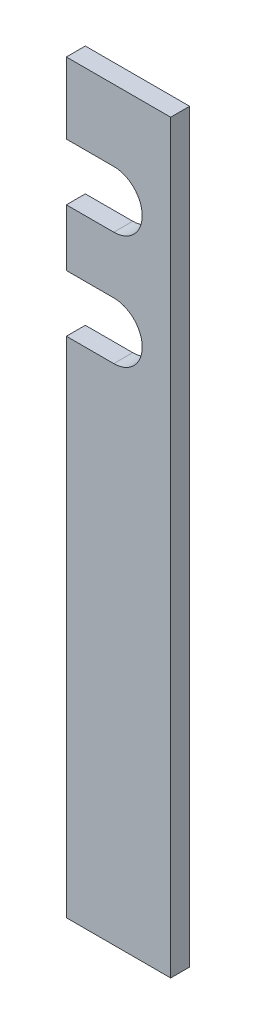
ISO-10303-21;
HEADER;
FILE_DESCRIPTION(('STEP AP214'),'2;1');
FILE_NAME('part.step','',(''),(''),'','','');
FILE_SCHEMA(('AUTOMOTIVE_DESIGN { 1 0 10303 214 1 1 1 1 }'));
ENDSEC;
DATA;
#1=APPLICATION_CONTEXT('core data for automotive mechanical design processes');
#2=APPLICATION_PROTOCOL_DEFINITION('international standard','automotive_design',2000,#1);
#3=PRODUCT_CONTEXT('',#1,'mechanical');
#4=PRODUCT('Part','Part','',(#3));
#5=PRODUCT_RELATED_PRODUCT_CATEGORY('part','',(#4));
#6=PRODUCT_DEFINITION_FORMATION('','',#4);
#7=PRODUCT_DEFINITION_CONTEXT('part definition',#1,'design');
#8=PRODUCT_DEFINITION('design','',#6,#7);
#9=PRODUCT_DEFINITION_SHAPE('','',#8);
#10=(LENGTH_UNIT() NAMED_UNIT(*) SI_UNIT(.MILLI.,.METRE.));
#11=(NAMED_UNIT(*) PLANE_ANGLE_UNIT() SI_UNIT($,.RADIAN.));
#12=(NAMED_UNIT(*) SI_UNIT($,.STERADIAN.) SOLID_ANGLE_UNIT());
#13=UNCERTAINTY_MEASURE_WITH_UNIT(LENGTH_MEASURE(1.E-05),#10,'distance_accuracy_value','');
#14=(GEOMETRIC_REPRESENTATION_CONTEXT(3) GLOBAL_UNCERTAINTY_ASSIGNED_CONTEXT((#13)) GLOBAL_UNIT_ASSIGNED_CONTEXT((#10,
#11,#12)) REPRESENTATION_CONTEXT('',''));
#15=CARTESIAN_POINT('',(0.,0.,0.));
#16=DIRECTION('',(0.,0.,1.));
#17=DIRECTION('',(1.,0.,0.));
#18=AXIS2_PLACEMENT_3D('',#15,#16,#17);
#19=CARTESIAN_POINT('',(-2.75,-19.65,1.));
#20=DIRECTION('',(1.,0.,0.));
#21=DIRECTION('',(0.,0.,-1.));
#22=AXIS2_PLACEMENT_3D('',#19,#20,#21);
#23=PLANE('',#22);
#24=DIRECTION('',(0.,0.,1.));
#25=VECTOR('',#24,1.);
#26=CARTESIAN_POINT('',(-2.75,6.9,0.));
#27=LINE('',#26,#25);
#28=CARTESIAN_POINT('',(-2.75,6.9,0.));
#29=VERTEX_POINT('',#28);
#30=CARTESIAN_POINT('',(-2.75,6.9,1.));
#31=VERTEX_POINT('',#30);
#32=EDGE_CURVE('E168',#29,#31,#27,.T.);
#33=ORIENTED_EDGE('',*,*,#32,.F.);
#34=DIRECTION('',(0.,-1.,0.));
#35=VECTOR('',#34,1.);
#36=CARTESIAN_POINT('',(-2.75,-19.65,0.));
#37=LINE('',#36,#35);
#38=CARTESIAN_POINT('',(-2.75,-19.65,0.));
#39=VERTEX_POINT('',#38);
#40=EDGE_CURVE('E158',#29,#39,#37,.T.);
#41=ORIENTED_EDGE('',*,*,#40,.T.);
#42=DIRECTION('',(0.,0.,-1.));
#43=VECTOR('',#42,1.);
#44=CARTESIAN_POINT('',(-2.75,-19.65,1.));
#45=LINE('',#44,#43);
#46=CARTESIAN_POINT('',(-2.75,-19.65,1.));
#47=VERTEX_POINT('',#46);
#48=EDGE_CURVE('E12',#47,#39,#45,.T.);
#49=ORIENTED_EDGE('',*,*,#48,.F.);
#50=DIRECTION('',(0.,-1.,0.));
#51=VECTOR('',#50,1.);
#52=CARTESIAN_POINT('',(-2.75,-19.65,1.));
#53=LINE('',#52,#51);
#54=EDGE_CURVE('E200',#31,#47,#53,.T.);
#55=ORIENTED_EDGE('',*,*,#54,.F.);
#56=EDGE_LOOP('',(#33,#41,#49,#55));
#57=FACE_BOUND('',#56,.T.);
#58=ADVANCED_FACE('F48',(#57),#23,.F.);
#59=CARTESIAN_POINT('',(-2.75,12.9,0.));
#60=VERTEX_POINT('',#59);
#61=CARTESIAN_POINT('',(-2.75,9.9,0.));
#62=VERTEX_POINT('',#61);
#63=EDGE_CURVE('E211',#60,#62,#37,.T.);
#64=ORIENTED_EDGE('',*,*,#63,.T.);
#65=DIRECTION('',(0.,0.,1.));
#66=VECTOR('',#65,1.);
#67=CARTESIAN_POINT('',(-2.75,9.9,0.));
#68=LINE('',#67,#66);
#69=CARTESIAN_POINT('',(-2.75,9.9,1.));
#70=VERTEX_POINT('',#69);
#71=EDGE_CURVE('E170',#62,#70,#68,.T.);
#72=ORIENTED_EDGE('',*,*,#71,.T.);
#73=CARTESIAN_POINT('',(-2.75,12.9,1.));
#74=VERTEX_POINT('',#73);
#75=EDGE_CURVE('E199',#74,#70,#53,.T.);
#76=ORIENTED_EDGE('',*,*,#75,.F.);
#77=DIRECTION('',(0.,0.,1.));
#78=VECTOR('',#77,1.);
#79=CARTESIAN_POINT('',(-2.75,12.9,0.));
#80=LINE('',#79,#78);
#81=EDGE_CURVE('E180',#60,#74,#80,.T.);
#82=ORIENTED_EDGE('',*,*,#81,.F.);
#83=EDGE_LOOP('',(#64,#72,#76,#82));
#84=FACE_BOUND('',#83,.T.);
#85=ADVANCED_FACE('F250',(#84),#23,.F.);
#86=CARTESIAN_POINT('',(0.,0.,1.));
#87=DIRECTION('',(0.,0.,1.));
#88=DIRECTION('',(1.,0.,0.));
#89=AXIS2_PLACEMENT_3D('',#86,#87,#88);
#90=PLANE('',#89);
#91=CARTESIAN_POINT('',(-0.25,8.4,1.));
#92=DIRECTION('',(0.,0.,1.));
#93=DIRECTION('',(1.,0.,0.));
#94=AXIS2_PLACEMENT_3D('',#91,#92,#93);
#95=CIRCLE('',#94,1.5);
#96=CARTESIAN_POINT('',(-0.25,6.9,1.));
#97=VERTEX_POINT('',#96);
#98=CARTESIAN_POINT('',(-0.25,9.9,1.));
#99=VERTEX_POINT('',#98);
#100=EDGE_CURVE('E161',#97,#99,#95,.T.);
#101=ORIENTED_EDGE('',*,*,#100,.F.);
#102=DIRECTION('',(-1.,0.,0.));
#103=VECTOR('',#102,1.);
#104=CARTESIAN_POINT('',(0.,6.9,1.));
#105=LINE('',#104,#103);
#106=EDGE_CURVE('E144',#97,#31,#105,.T.);
#107=ORIENTED_EDGE('',*,*,#106,.T.);
#108=ORIENTED_EDGE('',*,*,#54,.T.);
#109=DIRECTION('',(1.,0.,0.));
#110=VECTOR('',#109,1.);
#111=CARTESIAN_POINT('',(2.75,-19.65,1.));
#112=LINE('',#111,#110);
#113=CARTESIAN_POINT('',(2.75,-19.65,1.));
#114=VERTEX_POINT('',#113);
#115=EDGE_CURVE('E198',#47,#114,#112,.T.);
#116=ORIENTED_EDGE('',*,*,#115,.T.);
#117=DIRECTION('',(0.,1.,0.));
#118=VECTOR('',#117,1.);
#119=CARTESIAN_POINT('',(2.75,-19.65,1.));
#120=LINE('',#119,#118);
#121=CARTESIAN_POINT('',(2.75,19.65,1.));
#122=VERTEX_POINT('',#121);
#123=EDGE_CURVE('E202',#114,#122,#120,.T.);
#124=ORIENTED_EDGE('',*,*,#123,.T.);
#125=DIRECTION('',(-1.,0.,0.));
#126=VECTOR('',#125,1.);
#127=CARTESIAN_POINT('',(2.75,19.65,1.));
#128=LINE('',#127,#126);
#129=CARTESIAN_POINT('',(-2.75,19.65,1.));
#130=VERTEX_POINT('',#129);
#131=EDGE_CURVE('E204',#122,#130,#128,.T.);
#132=ORIENTED_EDGE('',*,*,#131,.T.);
#133=CARTESIAN_POINT('',(-2.75,15.9,1.));
#134=VERTEX_POINT('',#133);
#135=EDGE_CURVE('E195',#130,#134,#53,.T.);
#136=ORIENTED_EDGE('',*,*,#135,.T.);
#137=DIRECTION('',(-1.,0.,0.));
#138=VECTOR('',#137,1.);
#139=CARTESIAN_POINT('',(0.,15.9,1.));
#140=LINE('',#139,#138);
#141=CARTESIAN_POINT('',(-0.25,15.9,1.));
#142=VERTEX_POINT('',#141);
#143=EDGE_CURVE('E182',#142,#134,#140,.T.);
#144=ORIENTED_EDGE('',*,*,#143,.F.);
#145=CARTESIAN_POINT('',(-0.25,14.4,1.));
#146=DIRECTION('',(0.,0.,1.));
#147=DIRECTION('',(1.,0.,0.));
#148=AXIS2_PLACEMENT_3D('',#145,#146,#147);
#149=CIRCLE('',#148,1.5);
#150=CARTESIAN_POINT('',(-0.25,12.9,1.));
#151=VERTEX_POINT('',#150);
#152=EDGE_CURVE('E184',#151,#142,#149,.T.);
#153=ORIENTED_EDGE('',*,*,#152,.F.);
#154=DIRECTION('',(-1.,0.,0.));
#155=VECTOR('',#154,1.);
#156=CARTESIAN_POINT('',(0.,12.9,1.));
#157=LINE('',#156,#155);
#158=EDGE_CURVE('E166',#151,#74,#157,.T.);
#159=ORIENTED_EDGE('',*,*,#158,.T.);
#160=ORIENTED_EDGE('',*,*,#75,.T.);
#161=DIRECTION('',(-1.,0.,0.));
#162=VECTOR('',#161,1.);
#163=CARTESIAN_POINT('',(0.,9.9,1.));
#164=LINE('',#163,#162);
#165=EDGE_CURVE('E159',#99,#70,#164,.T.);
#166=ORIENTED_EDGE('',*,*,#165,.F.);
#167=EDGE_LOOP('',(#101,#107,#108,#116,#124,#132,#136,#144,#153,#159,#160,#166));
#168=FACE_BOUND('',#167,.T.);
#169=ADVANCED_FACE('F240',(#168),#90,.T.);
#170=CARTESIAN_POINT('',(0.,0.,0.));
#171=DIRECTION('',(0.,0.,1.));
#172=DIRECTION('',(1.,0.,0.));
#173=AXIS2_PLACEMENT_3D('',#170,#171,#172);
#174=PLANE('',#173);
#175=DIRECTION('',(-1.,0.,0.));
#176=VECTOR('',#175,1.);
#177=CARTESIAN_POINT('',(0.,6.9,0.));
#178=LINE('',#177,#176);
#179=CARTESIAN_POINT('',(-0.25,6.9,0.));
#180=VERTEX_POINT('',#179);
#181=EDGE_CURVE('E141',#180,#29,#178,.T.);
#182=ORIENTED_EDGE('',*,*,#181,.F.);
#183=CARTESIAN_POINT('',(-0.25,8.4,0.));
#184=DIRECTION('',(0.,0.,1.));
#185=DIRECTION('',(1.,0.,0.));
#186=AXIS2_PLACEMENT_3D('',#183,#184,#185);
#187=CIRCLE('',#186,1.5);
#188=CARTESIAN_POINT('',(-0.25,9.9,0.));
#189=VERTEX_POINT('',#188);
#190=EDGE_CURVE('E151',#180,#189,#187,.T.);
#191=ORIENTED_EDGE('',*,*,#190,.T.);
#192=DIRECTION('',(-1.,0.,0.));
#193=VECTOR('',#192,1.);
#194=CARTESIAN_POINT('',(0.,9.9,0.));
#195=LINE('',#194,#193);
#196=EDGE_CURVE('E63',#189,#62,#195,.T.);
#197=ORIENTED_EDGE('',*,*,#196,.T.);
#198=ORIENTED_EDGE('',*,*,#63,.F.);
#199=DIRECTION('',(-1.,0.,0.));
#200=VECTOR('',#199,1.);
#201=CARTESIAN_POINT('',(0.,12.9,0.));
#202=LINE('',#201,#200);
#203=CARTESIAN_POINT('',(-0.25,12.9,0.));
#204=VERTEX_POINT('',#203);
#205=EDGE_CURVE('E185',#204,#60,#202,.T.);
#206=ORIENTED_EDGE('',*,*,#205,.F.);
#207=CARTESIAN_POINT('',(-0.25,14.4,0.));
#208=DIRECTION('',(0.,0.,1.));
#209=DIRECTION('',(1.,0.,0.));
#210=AXIS2_PLACEMENT_3D('',#207,#208,#209);
#211=CIRCLE('',#210,1.5);
#212=CARTESIAN_POINT('',(-0.25,15.9,0.));
#213=VERTEX_POINT('',#212);
#214=EDGE_CURVE('E191',#204,#213,#211,.T.);
#215=ORIENTED_EDGE('',*,*,#214,.T.);
#216=DIRECTION('',(-1.,0.,0.));
#217=VECTOR('',#216,1.);
#218=CARTESIAN_POINT('',(0.,15.9,0.));
#219=LINE('',#218,#217);
#220=CARTESIAN_POINT('',(-2.75,15.9,0.));
#221=VERTEX_POINT('',#220);
#222=EDGE_CURVE('E176',#213,#221,#219,.T.);
#223=ORIENTED_EDGE('',*,*,#222,.T.);
#224=CARTESIAN_POINT('',(-2.75,19.65,0.));
#225=VERTEX_POINT('',#224);
#226=EDGE_CURVE('E207',#225,#221,#37,.T.);
#227=ORIENTED_EDGE('',*,*,#226,.F.);
#228=DIRECTION('',(-1.,0.,0.));
#229=VECTOR('',#228,1.);
#230=CARTESIAN_POINT('',(2.75,19.65,0.));
#231=LINE('',#230,#229);
#232=CARTESIAN_POINT('',(2.75,19.65,0.));
#233=VERTEX_POINT('',#232);
#234=EDGE_CURVE('E215',#233,#225,#231,.T.);
#235=ORIENTED_EDGE('',*,*,#234,.F.);
#236=DIRECTION('',(0.,1.,0.));
#237=VECTOR('',#236,1.);
#238=CARTESIAN_POINT('',(2.75,-19.65,0.));
#239=LINE('',#238,#237);
#240=CARTESIAN_POINT('',(2.75,-19.65,0.));
#241=VERTEX_POINT('',#240);
#242=EDGE_CURVE('E213',#241,#233,#239,.T.);
#243=ORIENTED_EDGE('',*,*,#242,.F.);
#244=DIRECTION('',(1.,0.,0.));
#245=VECTOR('',#244,1.);
#246=CARTESIAN_POINT('',(2.75,-19.65,0.));
#247=LINE('',#246,#245);
#248=EDGE_CURVE('E210',#39,#241,#247,.T.);
#249=ORIENTED_EDGE('',*,*,#248,.F.);
#250=ORIENTED_EDGE('',*,*,#40,.F.);
#251=EDGE_LOOP('',(#182,#191,#197,#198,#206,#215,#223,#227,#235,#243,#249,#250));
#252=FACE_BOUND('',#251,.T.);
#253=ADVANCED_FACE('F156',(#252),#174,.F.);
#254=ORIENTED_EDGE('',*,*,#226,.T.);
#255=DIRECTION('',(0.,0.,1.));
#256=VECTOR('',#255,1.);
#257=CARTESIAN_POINT('',(-2.75,15.9,0.));
#258=LINE('',#257,#256);
#259=EDGE_CURVE('E71',#221,#134,#258,.T.);
#260=ORIENTED_EDGE('',*,*,#259,.T.);
#261=ORIENTED_EDGE('',*,*,#135,.F.);
#262=DIRECTION('',(0.,0.,-1.));
#263=VECTOR('',#262,1.);
#264=CARTESIAN_POINT('',(-2.75,19.65,1.));
#265=LINE('',#264,#263);
#266=EDGE_CURVE('E206',#130,#225,#265,.T.);
#267=ORIENTED_EDGE('',*,*,#266,.T.);
#268=EDGE_LOOP('',(#254,#260,#261,#267));
#269=FACE_BOUND('',#268,.T.);
#270=ADVANCED_FACE('F50',(#269),#23,.F.);
#271=CARTESIAN_POINT('',(2.75,-19.65,1.));
#272=DIRECTION('',(0.,1.,0.));
#273=DIRECTION('',(0.,0.,1.));
#274=AXIS2_PLACEMENT_3D('',#271,#272,#273);
#275=PLANE('',#274);
#276=ORIENTED_EDGE('',*,*,#248,.T.);
#277=DIRECTION('',(0.,0.,-1.));
#278=VECTOR('',#277,1.);
#279=CARTESIAN_POINT('',(2.75,-19.65,1.));
#280=LINE('',#279,#278);
#281=EDGE_CURVE('E56',#114,#241,#280,.T.);
#282=ORIENTED_EDGE('',*,*,#281,.F.);
#283=ORIENTED_EDGE('',*,*,#115,.F.);
#284=ORIENTED_EDGE('',*,*,#48,.T.);
#285=EDGE_LOOP('',(#276,#282,#283,#284));
#286=FACE_BOUND('',#285,.T.);
#287=ADVANCED_FACE('F244',(#286),#275,.F.);
#288=CARTESIAN_POINT('',(2.75,-19.65,1.));
#289=DIRECTION('',(-1.,0.,0.));
#290=DIRECTION('',(0.,0.,1.));
#291=AXIS2_PLACEMENT_3D('',#288,#289,#290);
#292=PLANE('',#291);
#293=ORIENTED_EDGE('',*,*,#242,.T.);
#294=DIRECTION('',(0.,0.,-1.));
#295=VECTOR('',#294,1.);
#296=CARTESIAN_POINT('',(2.75,19.65,1.));
#297=LINE('',#296,#295);
#298=EDGE_CURVE('E219',#122,#233,#297,.T.);
#299=ORIENTED_EDGE('',*,*,#298,.F.);
#300=ORIENTED_EDGE('',*,*,#123,.F.);
#301=ORIENTED_EDGE('',*,*,#281,.T.);
#302=EDGE_LOOP('',(#293,#299,#300,#301));
#303=FACE_BOUND('',#302,.T.);
#304=ADVANCED_FACE('F226',(#303),#292,.F.);
#305=CARTESIAN_POINT('',(2.75,19.65,1.));
#306=DIRECTION('',(0.,-1.,0.));
#307=DIRECTION('',(0.,0.,-1.));
#308=AXIS2_PLACEMENT_3D('',#305,#306,#307);
#309=PLANE('',#308);
#310=ORIENTED_EDGE('',*,*,#234,.T.);
#311=ORIENTED_EDGE('',*,*,#266,.F.);
#312=ORIENTED_EDGE('',*,*,#131,.F.);
#313=ORIENTED_EDGE('',*,*,#298,.T.);
#314=EDGE_LOOP('',(#310,#311,#312,#313));
#315=FACE_BOUND('',#314,.T.);
#316=ADVANCED_FACE('F234',(#315),#309,.F.);
#317=CARTESIAN_POINT('',(-0.25,14.4,0.));
#318=DIRECTION('',(0.,0.,1.));
#319=DIRECTION('',(1.,0.,0.));
#320=AXIS2_PLACEMENT_3D('',#317,#318,#319);
#321=CYLINDRICAL_SURFACE('',#320,1.5);
#322=ORIENTED_EDGE('',*,*,#152,.T.);
#323=DIRECTION('',(0.,0.,1.));
#324=VECTOR('',#323,1.);
#325=CARTESIAN_POINT('',(-0.25,15.9,0.));
#326=LINE('',#325,#324);
#327=EDGE_CURVE('E177',#213,#142,#326,.T.);
#328=ORIENTED_EDGE('',*,*,#327,.F.);
#329=ORIENTED_EDGE('',*,*,#214,.F.);
#330=DIRECTION('',(0.,0.,1.));
#331=VECTOR('',#330,1.);
#332=CARTESIAN_POINT('',(-0.25,12.9,0.));
#333=LINE('',#332,#331);
#334=EDGE_CURVE('E174',#204,#151,#333,.T.);
#335=ORIENTED_EDGE('',*,*,#334,.T.);
#336=EDGE_LOOP('',(#322,#328,#329,#335));
#337=FACE_BOUND('',#336,.T.);
#338=ADVANCED_FACE('F259',(#337),#321,.F.);
#339=CARTESIAN_POINT('',(0.,12.9,0.));
#340=DIRECTION('',(0.,1.,0.));
#341=DIRECTION('',(0.,0.,1.));
#342=AXIS2_PLACEMENT_3D('',#339,#340,#341);
#343=PLANE('',#342);
#344=ORIENTED_EDGE('',*,*,#158,.F.);
#345=ORIENTED_EDGE('',*,*,#334,.F.);
#346=ORIENTED_EDGE('',*,*,#205,.T.);
#347=ORIENTED_EDGE('',*,*,#81,.T.);
#348=EDGE_LOOP('',(#344,#345,#346,#347));
#349=FACE_BOUND('',#348,.T.);
#350=ADVANCED_FACE('F257',(#349),#343,.T.);
#351=CARTESIAN_POINT('',(0.,15.9,0.));
#352=DIRECTION('',(0.,1.,0.));
#353=DIRECTION('',(0.,0.,1.));
#354=AXIS2_PLACEMENT_3D('',#351,#352,#353);
#355=PLANE('',#354);
#356=ORIENTED_EDGE('',*,*,#143,.T.);
#357=ORIENTED_EDGE('',*,*,#259,.F.);
#358=ORIENTED_EDGE('',*,*,#222,.F.);
#359=ORIENTED_EDGE('',*,*,#327,.T.);
#360=EDGE_LOOP('',(#356,#357,#358,#359));
#361=FACE_BOUND('',#360,.T.);
#362=ADVANCED_FACE('F260',(#361),#355,.F.);
#363=CARTESIAN_POINT('',(0.,6.9,0.));
#364=DIRECTION('',(0.,1.,0.));
#365=DIRECTION('',(-1.,0.,0.));
#366=AXIS2_PLACEMENT_3D('',#363,#364,#365);
#367=PLANE('',#366);
#368=ORIENTED_EDGE('',*,*,#106,.F.);
#369=DIRECTION('',(0.,0.,1.));
#370=VECTOR('',#369,1.);
#371=CARTESIAN_POINT('',(-0.25,6.9,0.));
#372=LINE('',#371,#370);
#373=EDGE_CURVE('E137',#180,#97,#372,.T.);
#374=ORIENTED_EDGE('',*,*,#373,.F.);
#375=ORIENTED_EDGE('',*,*,#181,.T.);
#376=ORIENTED_EDGE('',*,*,#32,.T.);
#377=EDGE_LOOP('',(#368,#374,#375,#376));
#378=FACE_BOUND('',#377,.T.);
#379=ADVANCED_FACE('F139',(#378),#367,.T.);
#380=CARTESIAN_POINT('',(0.,9.9,0.));
#381=DIRECTION('',(0.,1.,0.));
#382=DIRECTION('',(0.,0.,1.));
#383=AXIS2_PLACEMENT_3D('',#380,#381,#382);
#384=PLANE('',#383);
#385=ORIENTED_EDGE('',*,*,#165,.T.);
#386=ORIENTED_EDGE('',*,*,#71,.F.);
#387=ORIENTED_EDGE('',*,*,#196,.F.);
#388=DIRECTION('',(0.,0.,1.));
#389=VECTOR('',#388,1.);
#390=CARTESIAN_POINT('',(-0.25,9.9,0.));
#391=LINE('',#390,#389);
#392=EDGE_CURVE('E148',#189,#99,#391,.T.);
#393=ORIENTED_EDGE('',*,*,#392,.T.);
#394=EDGE_LOOP('',(#385,#386,#387,#393));
#395=FACE_BOUND('',#394,.T.);
#396=ADVANCED_FACE('F267',(#395),#384,.F.);
#397=CARTESIAN_POINT('',(-0.25,8.4,0.));
#398=DIRECTION('',(0.,0.,1.));
#399=DIRECTION('',(1.,0.,0.));
#400=AXIS2_PLACEMENT_3D('',#397,#398,#399);
#401=CYLINDRICAL_SURFACE('',#400,1.5);
#402=ORIENTED_EDGE('',*,*,#100,.T.);
#403=ORIENTED_EDGE('',*,*,#392,.F.);
#404=ORIENTED_EDGE('',*,*,#190,.F.);
#405=ORIENTED_EDGE('',*,*,#373,.T.);
#406=EDGE_LOOP('',(#402,#403,#404,#405));
#407=FACE_BOUND('',#406,.T.);
#408=ADVANCED_FACE('F152',(#407),#401,.F.);
#409=CLOSED_SHELL('',(#58,#85,#169,#253,#270,#287,#304,#316,#338,#350,#362,#379,#396,#408));
#410=MANIFOLD_SOLID_BREP('B2',#409);
#411=ADVANCED_BREP_SHAPE_REPRESENTATION('',(#18,#410),#14);
#412=SHAPE_DEFINITION_REPRESENTATION(#9,#411);
ENDSEC;
END-ISO-10303-21;
